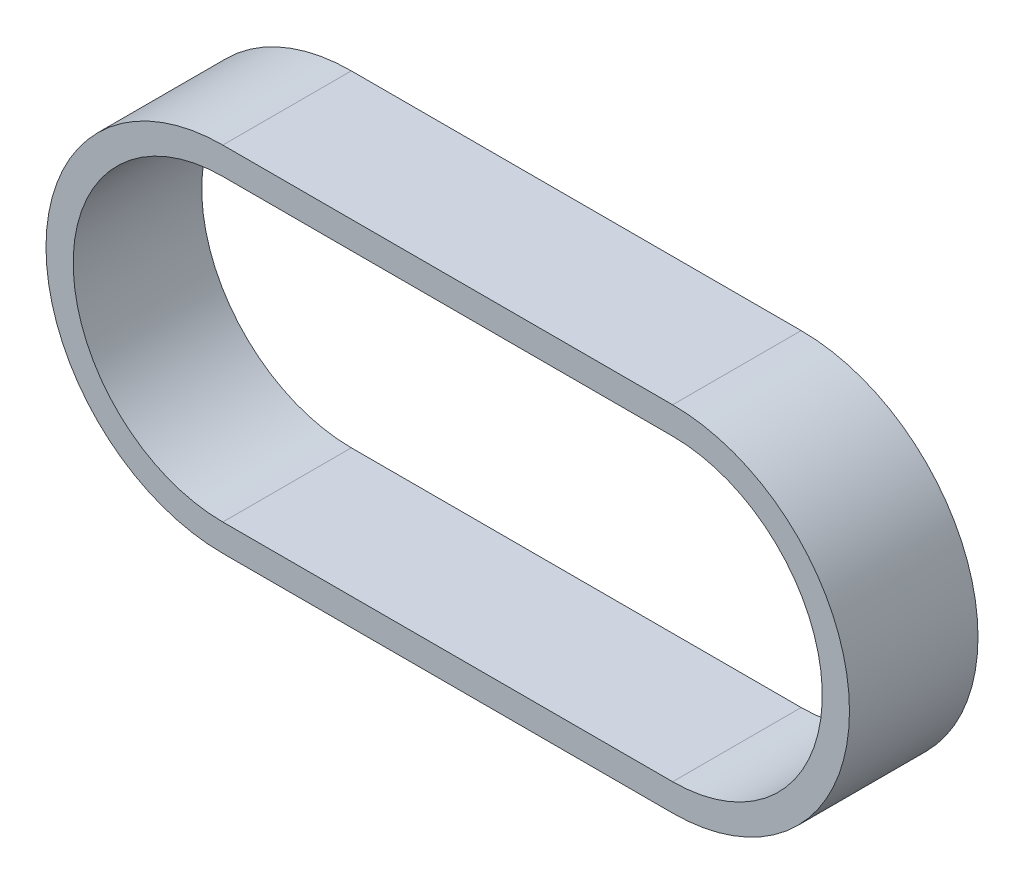
ISO-10303-21;
HEADER;
FILE_DESCRIPTION(('STEP AP214'),'2;1');
FILE_NAME('part.step','',(''),(''),'','','');
FILE_SCHEMA(('AUTOMOTIVE_DESIGN { 1 0 10303 214 1 1 1 1 }'));
ENDSEC;
DATA;
#1=APPLICATION_CONTEXT('core data for automotive mechanical design processes');
#2=APPLICATION_PROTOCOL_DEFINITION('international standard','automotive_design',2000,#1);
#3=PRODUCT_CONTEXT('',#1,'mechanical');
#4=PRODUCT('Part','Part','',(#3));
#5=PRODUCT_RELATED_PRODUCT_CATEGORY('part','',(#4));
#6=PRODUCT_DEFINITION_FORMATION('','',#4);
#7=PRODUCT_DEFINITION_CONTEXT('part definition',#1,'design');
#8=PRODUCT_DEFINITION('design','',#6,#7);
#9=PRODUCT_DEFINITION_SHAPE('','',#8);
#10=(LENGTH_UNIT() NAMED_UNIT(*) SI_UNIT(.MILLI.,.METRE.));
#11=(NAMED_UNIT(*) PLANE_ANGLE_UNIT() SI_UNIT($,.RADIAN.));
#12=(NAMED_UNIT(*) SI_UNIT($,.STERADIAN.) SOLID_ANGLE_UNIT());
#13=UNCERTAINTY_MEASURE_WITH_UNIT(LENGTH_MEASURE(1.E-05),#10,'distance_accuracy_value','');
#14=(GEOMETRIC_REPRESENTATION_CONTEXT(3) GLOBAL_UNCERTAINTY_ASSIGNED_CONTEXT((#13)) GLOBAL_UNIT_ASSIGNED_CONTEXT((#10,
#11,#12)) REPRESENTATION_CONTEXT('',''));
#15=CARTESIAN_POINT('',(0.,0.,0.));
#16=DIRECTION('',(0.,0.,1.));
#17=DIRECTION('',(1.,0.,0.));
#18=AXIS2_PLACEMENT_3D('',#15,#16,#17);
#19=CARTESIAN_POINT('',(0.,0.,15.));
#20=DIRECTION('',(0.,0.,1.));
#21=DIRECTION('',(1.,0.,0.));
#22=AXIS2_PLACEMENT_3D('',#19,#20,#21);
#23=PLANE('',#22);
#24=CARTESIAN_POINT('',(0.,0.,15.));
#25=DIRECTION('',(0.,0.,1.));
#26=DIRECTION('',(1.,0.,0.));
#27=AXIS2_PLACEMENT_3D('',#24,#25,#26);
#28=CIRCLE('',#27,20.6375);
#29=CARTESIAN_POINT('',(0.,20.6375,15.));
#30=VERTEX_POINT('',#29);
#31=CARTESIAN_POINT('',(0.,-20.6375,15.));
#32=VERTEX_POINT('',#31);
#33=EDGE_CURVE('E135',#30,#32,#28,.T.);
#34=ORIENTED_EDGE('',*,*,#33,.T.);
#35=DIRECTION('',(1.,0.,0.));
#36=VECTOR('',#35,1.);
#37=CARTESIAN_POINT('',(0.,-20.6375,15.));
#38=LINE('',#37,#36);
#39=CARTESIAN_POINT('',(52.5018,-20.6375,15.));
#40=VERTEX_POINT('',#39);
#41=EDGE_CURVE('E138',#32,#40,#38,.T.);
#42=ORIENTED_EDGE('',*,*,#41,.T.);
#43=CARTESIAN_POINT('',(52.5018,0.,15.));
#44=DIRECTION('',(0.,0.,1.));
#45=DIRECTION('',(1.,0.,0.));
#46=AXIS2_PLACEMENT_3D('',#43,#44,#45);
#47=CIRCLE('',#46,20.6375);
#48=CARTESIAN_POINT('',(52.5018,20.6375,15.));
#49=VERTEX_POINT('',#48);
#50=EDGE_CURVE('E141',#40,#49,#47,.T.);
#51=ORIENTED_EDGE('',*,*,#50,.T.);
#52=DIRECTION('',(-1.,0.,0.));
#53=VECTOR('',#52,1.);
#54=CARTESIAN_POINT('',(0.,20.6375,15.));
#55=LINE('',#54,#53);
#56=EDGE_CURVE('E143',#49,#30,#55,.T.);
#57=ORIENTED_EDGE('',*,*,#56,.T.);
#58=EDGE_LOOP('',(#34,#42,#51,#57));
#59=FACE_BOUND('',#58,.T.);
#60=DIRECTION('',(-1.,0.,0.));
#61=VECTOR('',#60,1.);
#62=CARTESIAN_POINT('',(0.,17.4625,15.));
#63=LINE('',#62,#61);
#64=CARTESIAN_POINT('',(52.5018,17.4625,15.));
#65=VERTEX_POINT('',#64);
#66=CARTESIAN_POINT('',(0.,17.4625,15.));
#67=VERTEX_POINT('',#66);
#68=EDGE_CURVE('E107',#65,#67,#63,.T.);
#69=ORIENTED_EDGE('',*,*,#68,.F.);
#70=CARTESIAN_POINT('',(52.5018,0.,15.));
#71=DIRECTION('',(0.,0.,1.));
#72=DIRECTION('',(1.,0.,0.));
#73=AXIS2_PLACEMENT_3D('',#70,#71,#72);
#74=CIRCLE('',#73,17.4625);
#75=CARTESIAN_POINT('',(52.5018,-17.4625,15.));
#76=VERTEX_POINT('',#75);
#77=EDGE_CURVE('E99',#76,#65,#74,.T.);
#78=ORIENTED_EDGE('',*,*,#77,.F.);
#79=DIRECTION('',(1.,0.,0.));
#80=VECTOR('',#79,1.);
#81=CARTESIAN_POINT('',(0.,-17.4625,15.));
#82=LINE('',#81,#80);
#83=CARTESIAN_POINT('',(0.,-17.4625,15.));
#84=VERTEX_POINT('',#83);
#85=EDGE_CURVE('E121',#84,#76,#82,.T.);
#86=ORIENTED_EDGE('',*,*,#85,.F.);
#87=CARTESIAN_POINT('',(0.,0.,15.));
#88=DIRECTION('',(0.,0.,1.));
#89=DIRECTION('',(1.,0.,0.));
#90=AXIS2_PLACEMENT_3D('',#87,#88,#89);
#91=CIRCLE('',#90,17.4625);
#92=EDGE_CURVE('E119',#67,#84,#91,.T.);
#93=ORIENTED_EDGE('',*,*,#92,.F.);
#94=EDGE_LOOP('',(#69,#78,#86,#93));
#95=FACE_BOUND('',#94,.T.);
#96=ADVANCED_FACE('F34',(#59,#95),#23,.T.);
#97=CARTESIAN_POINT('',(0.,0.,0.));
#98=DIRECTION('',(0.,0.,1.));
#99=DIRECTION('',(1.,0.,0.));
#100=AXIS2_PLACEMENT_3D('',#97,#98,#99);
#101=PLANE('',#100);
#102=CARTESIAN_POINT('',(0.,0.,0.));
#103=DIRECTION('',(0.,0.,1.));
#104=DIRECTION('',(1.,0.,0.));
#105=AXIS2_PLACEMENT_3D('',#102,#103,#104);
#106=CIRCLE('',#105,20.6375);
#107=CARTESIAN_POINT('',(0.,20.6375,0.));
#108=VERTEX_POINT('',#107);
#109=CARTESIAN_POINT('',(0.,-20.6375,0.));
#110=VERTEX_POINT('',#109);
#111=EDGE_CURVE('E115',#108,#110,#106,.T.);
#112=ORIENTED_EDGE('',*,*,#111,.F.);
#113=DIRECTION('',(-1.,0.,0.));
#114=VECTOR('',#113,1.);
#115=CARTESIAN_POINT('',(0.,20.6375,0.));
#116=LINE('',#115,#114);
#117=CARTESIAN_POINT('',(52.5018,20.6375,0.));
#118=VERTEX_POINT('',#117);
#119=EDGE_CURVE('E139',#118,#108,#116,.T.);
#120=ORIENTED_EDGE('',*,*,#119,.F.);
#121=CARTESIAN_POINT('',(52.5018,0.,0.));
#122=DIRECTION('',(0.,0.,1.));
#123=DIRECTION('',(1.,0.,0.));
#124=AXIS2_PLACEMENT_3D('',#121,#122,#123);
#125=CIRCLE('',#124,20.6375);
#126=CARTESIAN_POINT('',(52.5018,-20.6375,0.));
#127=VERTEX_POINT('',#126);
#128=EDGE_CURVE('E150',#127,#118,#125,.T.);
#129=ORIENTED_EDGE('',*,*,#128,.F.);
#130=DIRECTION('',(1.,0.,0.));
#131=VECTOR('',#130,1.);
#132=CARTESIAN_POINT('',(0.,-20.6375,0.));
#133=LINE('',#132,#131);
#134=EDGE_CURVE('E148',#110,#127,#133,.T.);
#135=ORIENTED_EDGE('',*,*,#134,.F.);
#136=EDGE_LOOP('',(#112,#120,#129,#135));
#137=FACE_BOUND('',#136,.T.);
#138=CARTESIAN_POINT('',(52.5018,0.,0.));
#139=DIRECTION('',(0.,0.,1.));
#140=DIRECTION('',(1.,0.,0.));
#141=AXIS2_PLACEMENT_3D('',#138,#139,#140);
#142=CIRCLE('',#141,17.4625);
#143=CARTESIAN_POINT('',(52.5018,-17.4625,0.));
#144=VERTEX_POINT('',#143);
#145=CARTESIAN_POINT('',(52.5018,17.4625,0.));
#146=VERTEX_POINT('',#145);
#147=EDGE_CURVE('E57',#144,#146,#142,.T.);
#148=ORIENTED_EDGE('',*,*,#147,.T.);
#149=DIRECTION('',(-1.,0.,0.));
#150=VECTOR('',#149,1.);
#151=CARTESIAN_POINT('',(0.,17.4625,0.));
#152=LINE('',#151,#150);
#153=CARTESIAN_POINT('',(0.,17.4625,0.));
#154=VERTEX_POINT('',#153);
#155=EDGE_CURVE('E114',#146,#154,#152,.T.);
#156=ORIENTED_EDGE('',*,*,#155,.T.);
#157=CARTESIAN_POINT('',(0.,0.,0.));
#158=DIRECTION('',(0.,0.,1.));
#159=DIRECTION('',(1.,0.,0.));
#160=AXIS2_PLACEMENT_3D('',#157,#158,#159);
#161=CIRCLE('',#160,17.4625);
#162=CARTESIAN_POINT('',(0.,-17.4625,0.));
#163=VERTEX_POINT('',#162);
#164=EDGE_CURVE('E127',#154,#163,#161,.T.);
#165=ORIENTED_EDGE('',*,*,#164,.T.);
#166=DIRECTION('',(1.,0.,0.));
#167=VECTOR('',#166,1.);
#168=CARTESIAN_POINT('',(0.,-17.4625,0.));
#169=LINE('',#168,#167);
#170=EDGE_CURVE('E108',#163,#144,#169,.T.);
#171=ORIENTED_EDGE('',*,*,#170,.T.);
#172=EDGE_LOOP('',(#148,#156,#165,#171));
#173=FACE_BOUND('',#172,.T.);
#174=ADVANCED_FACE('F168',(#137,#173),#101,.F.);
#175=CARTESIAN_POINT('',(0.,0.,15.));
#176=DIRECTION('',(0.,0.,-1.));
#177=DIRECTION('',(-1.,0.,0.));
#178=AXIS2_PLACEMENT_3D('',#175,#176,#177);
#179=CYLINDRICAL_SURFACE('',#178,20.6375);
#180=ORIENTED_EDGE('',*,*,#111,.T.);
#181=DIRECTION('',(0.,0.,-1.));
#182=VECTOR('',#181,1.);
#183=CARTESIAN_POINT('',(0.,-20.6375,15.));
#184=LINE('',#183,#182);
#185=EDGE_CURVE('E11',#32,#110,#184,.T.);
#186=ORIENTED_EDGE('',*,*,#185,.F.);
#187=ORIENTED_EDGE('',*,*,#33,.F.);
#188=DIRECTION('',(0.,0.,-1.));
#189=VECTOR('',#188,1.);
#190=CARTESIAN_POINT('',(0.,20.6375,15.));
#191=LINE('',#190,#189);
#192=EDGE_CURVE('E145',#30,#108,#191,.T.);
#193=ORIENTED_EDGE('',*,*,#192,.T.);
#194=EDGE_LOOP('',(#180,#186,#187,#193));
#195=FACE_BOUND('',#194,.T.);
#196=ADVANCED_FACE('F36',(#195),#179,.T.);
#197=CARTESIAN_POINT('',(0.,-20.6375,15.));
#198=DIRECTION('',(0.,1.,0.));
#199=DIRECTION('',(-1.,0.,0.));
#200=AXIS2_PLACEMENT_3D('',#197,#198,#199);
#201=PLANE('',#200);
#202=ORIENTED_EDGE('',*,*,#134,.T.);
#203=DIRECTION('',(0.,0.,-1.));
#204=VECTOR('',#203,1.);
#205=CARTESIAN_POINT('',(52.5018,-20.6375,15.));
#206=LINE('',#205,#204);
#207=EDGE_CURVE('E42',#40,#127,#206,.T.);
#208=ORIENTED_EDGE('',*,*,#207,.F.);
#209=ORIENTED_EDGE('',*,*,#41,.F.);
#210=ORIENTED_EDGE('',*,*,#185,.T.);
#211=EDGE_LOOP('',(#202,#208,#209,#210));
#212=FACE_BOUND('',#211,.T.);
#213=ADVANCED_FACE('F178',(#212),#201,.F.);
#214=CARTESIAN_POINT('',(52.5018,0.,15.));
#215=DIRECTION('',(0.,0.,-1.));
#216=DIRECTION('',(-1.,0.,0.));
#217=AXIS2_PLACEMENT_3D('',#214,#215,#216);
#218=CYLINDRICAL_SURFACE('',#217,20.6375);
#219=ORIENTED_EDGE('',*,*,#128,.T.);
#220=DIRECTION('',(0.,0.,-1.));
#221=VECTOR('',#220,1.);
#222=CARTESIAN_POINT('',(52.5018,20.6375,15.));
#223=LINE('',#222,#221);
#224=EDGE_CURVE('E155',#49,#118,#223,.T.);
#225=ORIENTED_EDGE('',*,*,#224,.F.);
#226=ORIENTED_EDGE('',*,*,#50,.F.);
#227=ORIENTED_EDGE('',*,*,#207,.T.);
#228=EDGE_LOOP('',(#219,#225,#226,#227));
#229=FACE_BOUND('',#228,.T.);
#230=ADVANCED_FACE('F162',(#229),#218,.T.);
#231=CARTESIAN_POINT('',(0.,20.6375,15.));
#232=DIRECTION('',(0.,-1.,0.));
#233=DIRECTION('',(1.,0.,0.));
#234=AXIS2_PLACEMENT_3D('',#231,#232,#233);
#235=PLANE('',#234);
#236=ORIENTED_EDGE('',*,*,#119,.T.);
#237=ORIENTED_EDGE('',*,*,#192,.F.);
#238=ORIENTED_EDGE('',*,*,#56,.F.);
#239=ORIENTED_EDGE('',*,*,#224,.T.);
#240=EDGE_LOOP('',(#236,#237,#238,#239));
#241=FACE_BOUND('',#240,.T.);
#242=ADVANCED_FACE('F172',(#241),#235,.F.);
#243=CARTESIAN_POINT('',(52.5018,0.,15.));
#244=DIRECTION('',(0.,0.,-1.));
#245=DIRECTION('',(-1.,0.,0.));
#246=AXIS2_PLACEMENT_3D('',#243,#244,#245);
#247=CYLINDRICAL_SURFACE('',#246,17.4625);
#248=ORIENTED_EDGE('',*,*,#147,.F.);
#249=DIRECTION('',(0.,0.,-1.));
#250=VECTOR('',#249,1.);
#251=CARTESIAN_POINT('',(52.5018,-17.4625,15.));
#252=LINE('',#251,#250);
#253=EDGE_CURVE('E103',#76,#144,#252,.T.);
#254=ORIENTED_EDGE('',*,*,#253,.F.);
#255=ORIENTED_EDGE('',*,*,#77,.T.);
#256=DIRECTION('',(0.,0.,-1.));
#257=VECTOR('',#256,1.);
#258=CARTESIAN_POINT('',(52.5018,17.4625,15.));
#259=LINE('',#258,#257);
#260=EDGE_CURVE('E102',#65,#146,#259,.T.);
#261=ORIENTED_EDGE('',*,*,#260,.T.);
#262=EDGE_LOOP('',(#248,#254,#255,#261));
#263=FACE_BOUND('',#262,.T.);
#264=ADVANCED_FACE('F101',(#263),#247,.F.);
#265=CARTESIAN_POINT('',(0.,17.4625,15.));
#266=DIRECTION('',(0.,-1.,0.));
#267=DIRECTION('',(0.,0.,-1.));
#268=AXIS2_PLACEMENT_3D('',#265,#266,#267);
#269=PLANE('',#268);
#270=ORIENTED_EDGE('',*,*,#155,.F.);
#271=ORIENTED_EDGE('',*,*,#260,.F.);
#272=ORIENTED_EDGE('',*,*,#68,.T.);
#273=DIRECTION('',(0.,0.,-1.));
#274=VECTOR('',#273,1.);
#275=CARTESIAN_POINT('',(0.,17.4625,15.));
#276=LINE('',#275,#274);
#277=EDGE_CURVE('E116',#67,#154,#276,.T.);
#278=ORIENTED_EDGE('',*,*,#277,.T.);
#279=EDGE_LOOP('',(#270,#271,#272,#278));
#280=FACE_BOUND('',#279,.T.);
#281=ADVANCED_FACE('F111',(#280),#269,.T.);
#282=CARTESIAN_POINT('',(0.,0.,15.));
#283=DIRECTION('',(0.,0.,-1.));
#284=DIRECTION('',(-1.,0.,0.));
#285=AXIS2_PLACEMENT_3D('',#282,#283,#284);
#286=CYLINDRICAL_SURFACE('',#285,17.4625);
#287=ORIENTED_EDGE('',*,*,#164,.F.);
#288=ORIENTED_EDGE('',*,*,#277,.F.);
#289=ORIENTED_EDGE('',*,*,#92,.T.);
#290=DIRECTION('',(0.,0.,-1.));
#291=VECTOR('',#290,1.);
#292=CARTESIAN_POINT('',(0.,-17.4625,15.));
#293=LINE('',#292,#291);
#294=EDGE_CURVE('E49',#84,#163,#293,.T.);
#295=ORIENTED_EDGE('',*,*,#294,.T.);
#296=EDGE_LOOP('',(#287,#288,#289,#295));
#297=FACE_BOUND('',#296,.T.);
#298=ADVANCED_FACE('F201',(#297),#286,.F.);
#299=CARTESIAN_POINT('',(0.,-17.4625,15.));
#300=DIRECTION('',(0.,1.,0.));
#301=DIRECTION('',(0.,0.,1.));
#302=AXIS2_PLACEMENT_3D('',#299,#300,#301);
#303=PLANE('',#302);
#304=ORIENTED_EDGE('',*,*,#170,.F.);
#305=ORIENTED_EDGE('',*,*,#294,.F.);
#306=ORIENTED_EDGE('',*,*,#85,.T.);
#307=ORIENTED_EDGE('',*,*,#253,.T.);
#308=EDGE_LOOP('',(#304,#305,#306,#307));
#309=FACE_BOUND('',#308,.T.);
#310=ADVANCED_FACE('F205',(#309),#303,.T.);
#311=CLOSED_SHELL('',(#96,#174,#196,#213,#230,#242,#264,#281,#298,#310));
#312=MANIFOLD_SOLID_BREP('B2',#311);
#313=ADVANCED_BREP_SHAPE_REPRESENTATION('',(#18,#312),#14);
#314=SHAPE_DEFINITION_REPRESENTATION(#9,#313);
ENDSEC;
END-ISO-10303-21;
